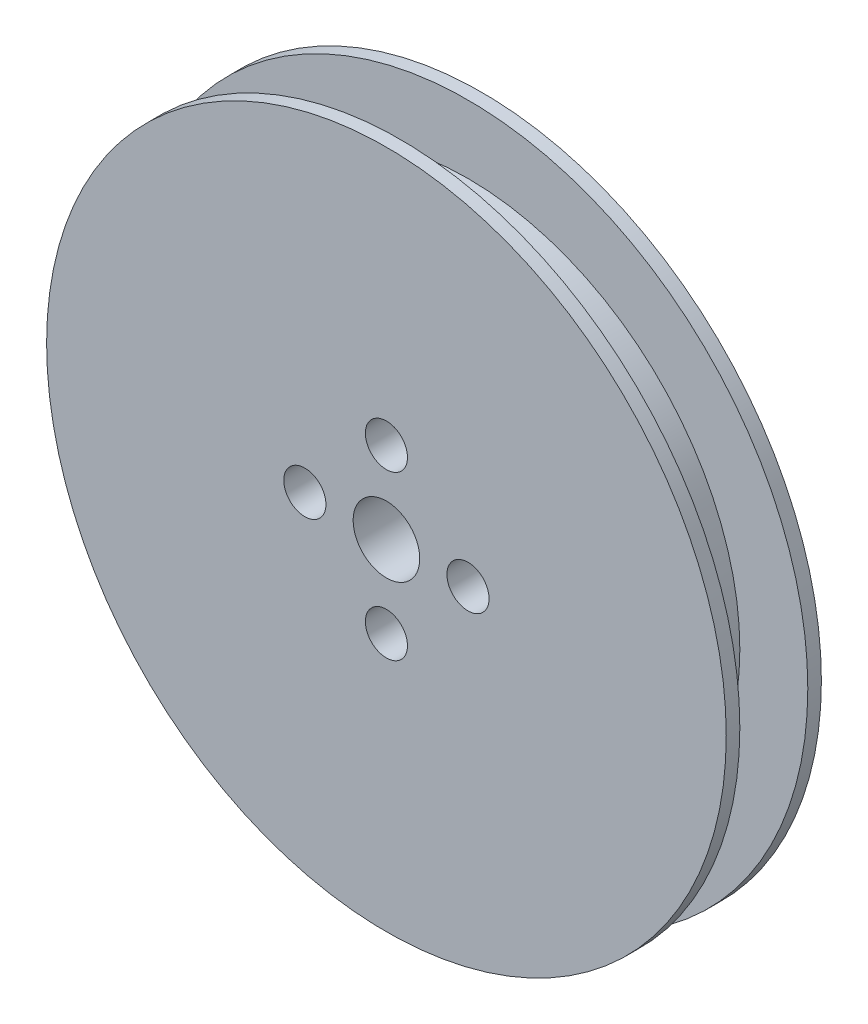
ISO-10303-21;
HEADER;
FILE_DESCRIPTION(('STEP AP214'),'2;1');
FILE_NAME('part.step','',(''),(''),'','','');
FILE_SCHEMA(('AUTOMOTIVE_DESIGN { 1 0 10303 214 1 1 1 1 }'));
ENDSEC;
DATA;
#1=APPLICATION_CONTEXT('core data for automotive mechanical design processes');
#2=APPLICATION_PROTOCOL_DEFINITION('international standard','automotive_design',2000,#1);
#3=PRODUCT_CONTEXT('',#1,'mechanical');
#4=PRODUCT('Part','Part','',(#3));
#5=PRODUCT_RELATED_PRODUCT_CATEGORY('part','',(#4));
#6=PRODUCT_DEFINITION_FORMATION('','',#4);
#7=PRODUCT_DEFINITION_CONTEXT('part definition',#1,'design');
#8=PRODUCT_DEFINITION('design','',#6,#7);
#9=PRODUCT_DEFINITION_SHAPE('','',#8);
#10=(LENGTH_UNIT() NAMED_UNIT(*) SI_UNIT(.MILLI.,.METRE.));
#11=(NAMED_UNIT(*) PLANE_ANGLE_UNIT() SI_UNIT($,.RADIAN.));
#12=(NAMED_UNIT(*) SI_UNIT($,.STERADIAN.) SOLID_ANGLE_UNIT());
#13=UNCERTAINTY_MEASURE_WITH_UNIT(LENGTH_MEASURE(1.E-05),#10,'distance_accuracy_value','');
#14=(GEOMETRIC_REPRESENTATION_CONTEXT(3) GLOBAL_UNCERTAINTY_ASSIGNED_CONTEXT((#13)) GLOBAL_UNIT_ASSIGNED_CONTEXT((#10,
#11,#12)) REPRESENTATION_CONTEXT('',''));
#15=CARTESIAN_POINT('',(0.,0.,0.));
#16=DIRECTION('',(0.,0.,1.));
#17=DIRECTION('',(1.,0.,0.));
#18=AXIS2_PLACEMENT_3D('',#15,#16,#17);
#19=CARTESIAN_POINT('',(0.,0.,0.));
#20=DIRECTION('',(0.,0.,1.));
#21=DIRECTION('',(1.,0.,0.));
#22=AXIS2_PLACEMENT_3D('',#19,#20,#21);
#23=PLANE('',#22);
#24=CARTESIAN_POINT('',(0.,6.,0.));
#25=DIRECTION('',(0.,0.,-1.));
#26=DIRECTION('',(-1.,0.,0.));
#27=AXIS2_PLACEMENT_3D('',#24,#25,#26);
#28=CIRCLE('',#27,1.55);
#29=CARTESIAN_POINT('',(-1.55,6.,0.));
#30=VERTEX_POINT('',#29);
#31=EDGE_CURVE('E86',#30,#30,#28,.T.);
#32=ORIENTED_EDGE('',*,*,#31,.F.);
#33=EDGE_LOOP('',(#32));
#34=FACE_BOUND('',#33,.T.);
#35=CARTESIAN_POINT('',(5.99999999999983,-1.7016286254268E-13,0.));
#36=DIRECTION('',(0.,0.,-1.));
#37=DIRECTION('',(-1.,0.,0.));
#38=AXIS2_PLACEMENT_3D('',#35,#36,#37);
#39=CIRCLE('',#38,1.55000000000027);
#40=CARTESIAN_POINT('',(4.44999999999956,-1.7016286254268E-13,0.));
#41=VERTEX_POINT('',#40);
#42=EDGE_CURVE('E87',#41,#41,#39,.T.);
#43=ORIENTED_EDGE('',*,*,#42,.F.);
#44=EDGE_LOOP('',(#43));
#45=FACE_BOUND('',#44,.T.);
#46=CARTESIAN_POINT('',(-3.38856148926383E-13,-6.,0.));
#47=DIRECTION('',(0.,0.,-1.));
#48=DIRECTION('',(-1.,0.,0.));
#49=AXIS2_PLACEMENT_3D('',#46,#47,#48);
#50=CIRCLE('',#49,1.55000000000036);
#51=CARTESIAN_POINT('',(-1.5500000000007,-6.,0.));
#52=VERTEX_POINT('',#51);
#53=EDGE_CURVE('E95',#52,#52,#50,.T.);
#54=ORIENTED_EDGE('',*,*,#53,.F.);
#55=EDGE_LOOP('',(#54));
#56=FACE_BOUND('',#55,.T.);
#57=CARTESIAN_POINT('',(-6.00000000000017,1.69428074463191E-13,0.));
#58=DIRECTION('',(0.,0.,-1.));
#59=DIRECTION('',(-1.,0.,0.));
#60=AXIS2_PLACEMENT_3D('',#57,#58,#59);
#61=CIRCLE('',#60,1.55000000000013);
#62=CARTESIAN_POINT('',(-7.5500000000003,1.69428074463191E-13,0.));
#63=VERTEX_POINT('',#62);
#64=EDGE_CURVE('E69',#63,#63,#61,.T.);
#65=ORIENTED_EDGE('',*,*,#64,.F.);
#66=EDGE_LOOP('',(#65));
#67=FACE_BOUND('',#66,.T.);
#68=CARTESIAN_POINT('',(0.,0.,0.));
#69=DIRECTION('',(0.,0.,-1.));
#70=DIRECTION('',(-1.,0.,0.));
#71=AXIS2_PLACEMENT_3D('',#68,#69,#70);
#72=CIRCLE('',#71,2.45);
#73=CARTESIAN_POINT('',(-2.45,0.,0.));
#74=VERTEX_POINT('',#73);
#75=EDGE_CURVE('E78',#74,#74,#72,.T.);
#76=ORIENTED_EDGE('',*,*,#75,.F.);
#77=EDGE_LOOP('',(#76));
#78=FACE_BOUND('',#77,.T.);
#79=CARTESIAN_POINT('',(0.,0.,0.));
#80=DIRECTION('',(0.,0.,1.));
#81=DIRECTION('',(1.,0.,0.));
#82=AXIS2_PLACEMENT_3D('',#79,#80,#81);
#83=CIRCLE('',#82,25.);
#84=CARTESIAN_POINT('',(25.,0.,0.));
#85=VERTEX_POINT('',#84);
#86=EDGE_CURVE('E10',#85,#85,#83,.T.);
#87=ORIENTED_EDGE('',*,*,#86,.F.);
#88=EDGE_LOOP('',(#87));
#89=FACE_BOUND('',#88,.T.);
#90=ADVANCED_FACE('F37',(#34,#45,#56,#67,#78,#89),#23,.F.);
#91=CARTESIAN_POINT('',(0.,0.,7.));
#92=DIRECTION('',(0.,0.,1.));
#93=DIRECTION('',(1.,0.,0.));
#94=AXIS2_PLACEMENT_3D('',#91,#92,#93);
#95=CYLINDRICAL_SURFACE('',#94,25.);
#96=CARTESIAN_POINT('',(0.,0.,1.));
#97=DIRECTION('',(0.,0.,1.));
#98=DIRECTION('',(1.,0.,0.));
#99=AXIS2_PLACEMENT_3D('',#96,#97,#98);
#100=CIRCLE('',#99,25.);
#101=CARTESIAN_POINT('',(25.,0.,1.));
#102=VERTEX_POINT('',#101);
#103=EDGE_CURVE('E44',#102,#102,#100,.T.);
#104=ORIENTED_EDGE('',*,*,#103,.F.);
#105=EDGE_LOOP('',(#104));
#106=FACE_BOUND('',#105,.T.);
#107=ORIENTED_EDGE('',*,*,#86,.T.);
#108=EDGE_LOOP('',(#107));
#109=FACE_BOUND('',#108,.T.);
#110=ADVANCED_FACE('F121',(#106,#109),#95,.T.);
#111=CARTESIAN_POINT('',(-25.,0.,1.));
#112=DIRECTION('',(0.,0.,-1.));
#113=DIRECTION('',(-1.,0.,0.));
#114=AXIS2_PLACEMENT_3D('',#111,#112,#113);
#115=PLANE('',#114);
#116=CARTESIAN_POINT('',(0.,0.,1.));
#117=DIRECTION('',(0.,0.,1.));
#118=DIRECTION('',(1.,0.,0.));
#119=AXIS2_PLACEMENT_3D('',#116,#117,#118);
#120=CIRCLE('',#119,20.);
#121=CARTESIAN_POINT('',(20.,0.,1.));
#122=VERTEX_POINT('',#121);
#123=EDGE_CURVE('E49',#122,#122,#120,.T.);
#124=ORIENTED_EDGE('',*,*,#123,.F.);
#125=EDGE_LOOP('',(#124));
#126=FACE_BOUND('',#125,.T.);
#127=ORIENTED_EDGE('',*,*,#103,.T.);
#128=EDGE_LOOP('',(#127));
#129=FACE_BOUND('',#128,.T.);
#130=ADVANCED_FACE('F159',(#126,#129),#115,.F.);
#131=CARTESIAN_POINT('',(0.,0.,7.));
#132=DIRECTION('',(0.,0.,1.));
#133=DIRECTION('',(1.,0.,0.));
#134=AXIS2_PLACEMENT_3D('',#131,#132,#133);
#135=CYLINDRICAL_SURFACE('',#134,20.);
#136=CARTESIAN_POINT('',(0.,0.,6.));
#137=DIRECTION('',(0.,0.,1.));
#138=DIRECTION('',(1.,0.,0.));
#139=AXIS2_PLACEMENT_3D('',#136,#137,#138);
#140=CIRCLE('',#139,20.);
#141=CARTESIAN_POINT('',(20.,0.,6.));
#142=VERTEX_POINT('',#141);
#143=EDGE_CURVE('E54',#142,#142,#140,.T.);
#144=ORIENTED_EDGE('',*,*,#143,.F.);
#145=EDGE_LOOP('',(#144));
#146=FACE_BOUND('',#145,.T.);
#147=ORIENTED_EDGE('',*,*,#123,.T.);
#148=EDGE_LOOP('',(#147));
#149=FACE_BOUND('',#148,.T.);
#150=ADVANCED_FACE('F155',(#146,#149),#135,.T.);
#151=CARTESIAN_POINT('',(-20.,0.,6.));
#152=DIRECTION('',(0.,0.,1.));
#153=DIRECTION('',(1.,0.,0.));
#154=AXIS2_PLACEMENT_3D('',#151,#152,#153);
#155=PLANE('',#154);
#156=CARTESIAN_POINT('',(0.,0.,6.));
#157=DIRECTION('',(0.,0.,1.));
#158=DIRECTION('',(1.,0.,0.));
#159=AXIS2_PLACEMENT_3D('',#156,#157,#158);
#160=CIRCLE('',#159,25.);
#161=CARTESIAN_POINT('',(25.,0.,6.));
#162=VERTEX_POINT('',#161);
#163=EDGE_CURVE('E60',#162,#162,#160,.T.);
#164=ORIENTED_EDGE('',*,*,#163,.F.);
#165=EDGE_LOOP('',(#164));
#166=FACE_BOUND('',#165,.T.);
#167=ORIENTED_EDGE('',*,*,#143,.T.);
#168=EDGE_LOOP('',(#167));
#169=FACE_BOUND('',#168,.T.);
#170=ADVANCED_FACE('F151',(#166,#169),#155,.F.);
#171=CARTESIAN_POINT('',(0.,0.,7.));
#172=DIRECTION('',(0.,0.,1.));
#173=DIRECTION('',(1.,0.,0.));
#174=AXIS2_PLACEMENT_3D('',#171,#172,#173);
#175=CYLINDRICAL_SURFACE('',#174,25.);
#176=CARTESIAN_POINT('',(0.,0.,7.));
#177=DIRECTION('',(0.,0.,1.));
#178=DIRECTION('',(1.,0.,0.));
#179=AXIS2_PLACEMENT_3D('',#176,#177,#178);
#180=CIRCLE('',#179,25.);
#181=CARTESIAN_POINT('',(25.,0.,7.));
#182=VERTEX_POINT('',#181);
#183=EDGE_CURVE('E64',#182,#182,#180,.T.);
#184=ORIENTED_EDGE('',*,*,#183,.F.);
#185=EDGE_LOOP('',(#184));
#186=FACE_BOUND('',#185,.T.);
#187=ORIENTED_EDGE('',*,*,#163,.T.);
#188=EDGE_LOOP('',(#187));
#189=FACE_BOUND('',#188,.T.);
#190=ADVANCED_FACE('F143',(#186,#189),#175,.T.);
#191=CARTESIAN_POINT('',(-25.,0.,7.));
#192=DIRECTION('',(0.,0.,-1.));
#193=DIRECTION('',(-1.,0.,0.));
#194=AXIS2_PLACEMENT_3D('',#191,#192,#193);
#195=PLANE('',#194);
#196=CARTESIAN_POINT('',(0.,6.,7.));
#197=DIRECTION('',(0.,0.,-1.));
#198=DIRECTION('',(-1.,0.,0.));
#199=AXIS2_PLACEMENT_3D('',#196,#197,#198);
#200=CIRCLE('',#199,1.55);
#201=CARTESIAN_POINT('',(-1.55,6.,7.));
#202=VERTEX_POINT('',#201);
#203=EDGE_CURVE('E68',#202,#202,#200,.T.);
#204=ORIENTED_EDGE('',*,*,#203,.T.);
#205=EDGE_LOOP('',(#204));
#206=FACE_BOUND('',#205,.T.);
#207=CARTESIAN_POINT('',(5.99999999999983,-1.7016286254268E-13,7.));
#208=DIRECTION('',(0.,0.,-1.));
#209=DIRECTION('',(-1.,0.,0.));
#210=AXIS2_PLACEMENT_3D('',#207,#208,#209);
#211=CIRCLE('',#210,1.55000000000027);
#212=CARTESIAN_POINT('',(4.44999999999956,-1.7016286254268E-13,7.));
#213=VERTEX_POINT('',#212);
#214=EDGE_CURVE('E91',#213,#213,#211,.T.);
#215=ORIENTED_EDGE('',*,*,#214,.T.);
#216=EDGE_LOOP('',(#215));
#217=FACE_BOUND('',#216,.T.);
#218=CARTESIAN_POINT('',(-3.38856148926383E-13,-6.,7.));
#219=DIRECTION('',(0.,0.,-1.));
#220=DIRECTION('',(-1.,0.,0.));
#221=AXIS2_PLACEMENT_3D('',#218,#219,#220);
#222=CIRCLE('',#221,1.55000000000036);
#223=CARTESIAN_POINT('',(-1.5500000000007,-6.,7.));
#224=VERTEX_POINT('',#223);
#225=EDGE_CURVE('E74',#224,#224,#222,.T.);
#226=ORIENTED_EDGE('',*,*,#225,.T.);
#227=EDGE_LOOP('',(#226));
#228=FACE_BOUND('',#227,.T.);
#229=CARTESIAN_POINT('',(-6.00000000000017,1.69428074463191E-13,7.));
#230=DIRECTION('',(0.,0.,-1.));
#231=DIRECTION('',(-1.,0.,0.));
#232=AXIS2_PLACEMENT_3D('',#229,#230,#231);
#233=CIRCLE('',#232,1.55000000000013);
#234=CARTESIAN_POINT('',(-7.5500000000003,1.69428074463191E-13,7.));
#235=VERTEX_POINT('',#234);
#236=EDGE_CURVE('E73',#235,#235,#233,.T.);
#237=ORIENTED_EDGE('',*,*,#236,.T.);
#238=EDGE_LOOP('',(#237));
#239=FACE_BOUND('',#238,.T.);
#240=CARTESIAN_POINT('',(0.,0.,7.));
#241=DIRECTION('',(0.,0.,-1.));
#242=DIRECTION('',(-1.,0.,0.));
#243=AXIS2_PLACEMENT_3D('',#240,#241,#242);
#244=CIRCLE('',#243,2.45);
#245=CARTESIAN_POINT('',(-2.45,0.,7.));
#246=VERTEX_POINT('',#245);
#247=EDGE_CURVE('E82',#246,#246,#244,.T.);
#248=ORIENTED_EDGE('',*,*,#247,.T.);
#249=EDGE_LOOP('',(#248));
#250=FACE_BOUND('',#249,.T.);
#251=ORIENTED_EDGE('',*,*,#183,.T.);
#252=EDGE_LOOP('',(#251));
#253=FACE_BOUND('',#252,.T.);
#254=ADVANCED_FACE('F109',(#206,#217,#228,#239,#250,#253),#195,.F.);
#255=CARTESIAN_POINT('',(0.,0.,7.));
#256=DIRECTION('',(0.,0.,-1.));
#257=DIRECTION('',(-1.,0.,0.));
#258=AXIS2_PLACEMENT_3D('',#255,#256,#257);
#259=CYLINDRICAL_SURFACE('',#258,2.45);
#260=ORIENTED_EDGE('',*,*,#247,.F.);
#261=EDGE_LOOP('',(#260));
#262=FACE_BOUND('',#261,.T.);
#263=ORIENTED_EDGE('',*,*,#75,.T.);
#264=EDGE_LOOP('',(#263));
#265=FACE_BOUND('',#264,.T.);
#266=ADVANCED_FACE('F131',(#262,#265),#259,.F.);
#267=CARTESIAN_POINT('',(-6.00000000000017,1.69428074463191E-13,7.));
#268=DIRECTION('',(0.,0.,-1.));
#269=DIRECTION('',(-1.,0.,0.));
#270=AXIS2_PLACEMENT_3D('',#267,#268,#269);
#271=CYLINDRICAL_SURFACE('',#270,1.55000000000013);
#272=ORIENTED_EDGE('',*,*,#236,.F.);
#273=EDGE_LOOP('',(#272));
#274=FACE_BOUND('',#273,.T.);
#275=ORIENTED_EDGE('',*,*,#64,.T.);
#276=EDGE_LOOP('',(#275));
#277=FACE_BOUND('',#276,.T.);
#278=ADVANCED_FACE('F133',(#274,#277),#271,.F.);
#279=CARTESIAN_POINT('',(-3.38856148926383E-13,-6.,7.));
#280=DIRECTION('',(0.,0.,-1.));
#281=DIRECTION('',(-1.,0.,0.));
#282=AXIS2_PLACEMENT_3D('',#279,#280,#281);
#283=CYLINDRICAL_SURFACE('',#282,1.55000000000036);
#284=ORIENTED_EDGE('',*,*,#225,.F.);
#285=EDGE_LOOP('',(#284));
#286=FACE_BOUND('',#285,.T.);
#287=ORIENTED_EDGE('',*,*,#53,.T.);
#288=EDGE_LOOP('',(#287));
#289=FACE_BOUND('',#288,.T.);
#290=ADVANCED_FACE('F140',(#286,#289),#283,.F.);
#291=CARTESIAN_POINT('',(5.99999999999983,-1.7016286254268E-13,7.));
#292=DIRECTION('',(0.,0.,-1.));
#293=DIRECTION('',(-1.,0.,0.));
#294=AXIS2_PLACEMENT_3D('',#291,#292,#293);
#295=CYLINDRICAL_SURFACE('',#294,1.55000000000027);
#296=ORIENTED_EDGE('',*,*,#214,.F.);
#297=EDGE_LOOP('',(#296));
#298=FACE_BOUND('',#297,.T.);
#299=ORIENTED_EDGE('',*,*,#42,.T.);
#300=EDGE_LOOP('',(#299));
#301=FACE_BOUND('',#300,.T.);
#302=ADVANCED_FACE('F115',(#298,#301),#295,.F.);
#303=CARTESIAN_POINT('',(0.,6.,7.));
#304=DIRECTION('',(0.,0.,-1.));
#305=DIRECTION('',(-1.,0.,0.));
#306=AXIS2_PLACEMENT_3D('',#303,#304,#305);
#307=CYLINDRICAL_SURFACE('',#306,1.55);
#308=ORIENTED_EDGE('',*,*,#203,.F.);
#309=EDGE_LOOP('',(#308));
#310=FACE_BOUND('',#309,.T.);
#311=ORIENTED_EDGE('',*,*,#31,.T.);
#312=EDGE_LOOP('',(#311));
#313=FACE_BOUND('',#312,.T.);
#314=ADVANCED_FACE('F112',(#310,#313),#307,.F.);
#315=CLOSED_SHELL('',(#90,#110,#130,#150,#170,#190,#254,#266,#278,#290,#302,#314));
#316=MANIFOLD_SOLID_BREP('B2',#315);
#317=ADVANCED_BREP_SHAPE_REPRESENTATION('',(#18,#316),#14);
#318=SHAPE_DEFINITION_REPRESENTATION(#9,#317);
ENDSEC;
END-ISO-10303-21;
